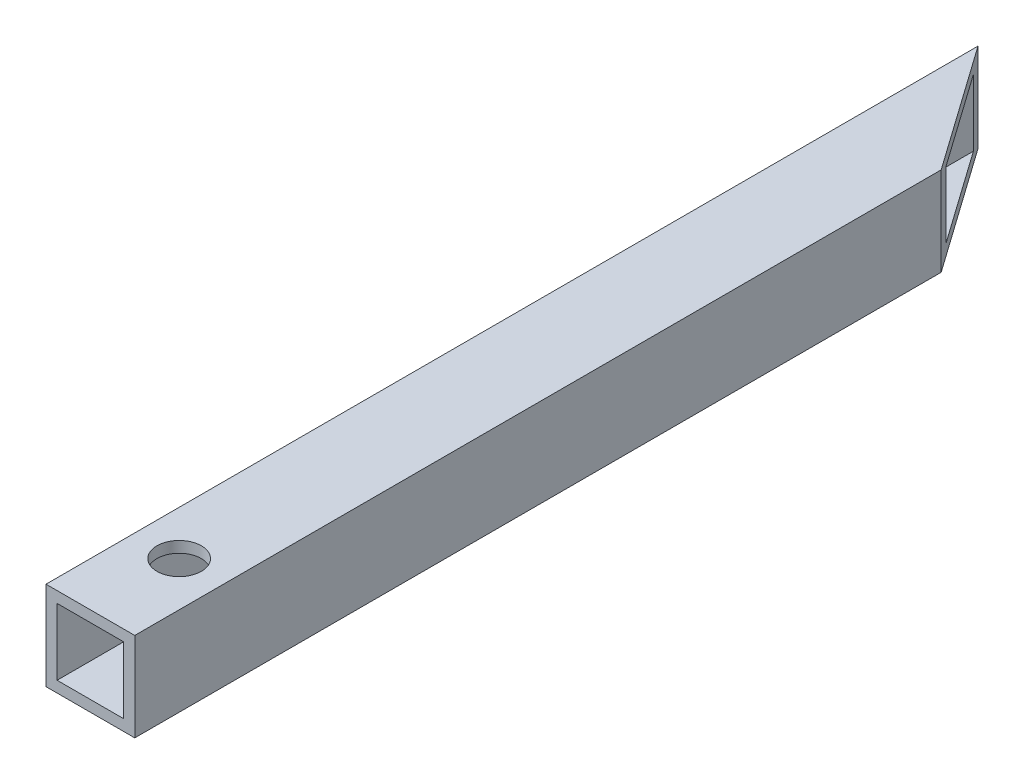
ISO-10303-21;
HEADER;
FILE_DESCRIPTION(('STEP AP214'),'2;1');
FILE_NAME('part.step','',(''),(''),'','','');
FILE_SCHEMA(('AUTOMOTIVE_DESIGN { 1 0 10303 214 1 1 1 1 }'));
ENDSEC;
DATA;
#1=APPLICATION_CONTEXT('core data for automotive mechanical design processes');
#2=APPLICATION_PROTOCOL_DEFINITION('international standard','automotive_design',2000,#1);
#3=PRODUCT_CONTEXT('',#1,'mechanical');
#4=PRODUCT('Part','Part','',(#3));
#5=PRODUCT_RELATED_PRODUCT_CATEGORY('part','',(#4));
#6=PRODUCT_DEFINITION_FORMATION('','',#4);
#7=PRODUCT_DEFINITION_CONTEXT('part definition',#1,'design');
#8=PRODUCT_DEFINITION('design','',#6,#7);
#9=PRODUCT_DEFINITION_SHAPE('','',#8);
#10=(LENGTH_UNIT() NAMED_UNIT(*) SI_UNIT(.MILLI.,.METRE.));
#11=(NAMED_UNIT(*) PLANE_ANGLE_UNIT() SI_UNIT($,.RADIAN.));
#12=(NAMED_UNIT(*) SI_UNIT($,.STERADIAN.) SOLID_ANGLE_UNIT());
#13=UNCERTAINTY_MEASURE_WITH_UNIT(LENGTH_MEASURE(1.E-05),#10,'distance_accuracy_value','');
#14=(GEOMETRIC_REPRESENTATION_CONTEXT(3) GLOBAL_UNCERTAINTY_ASSIGNED_CONTEXT((#13)) GLOBAL_UNIT_ASSIGNED_CONTEXT((#10,
#11,#12)) REPRESENTATION_CONTEXT('',''));
#15=CARTESIAN_POINT('',(0.,0.,0.));
#16=DIRECTION('',(0.,0.,1.));
#17=DIRECTION('',(1.,0.,0.));
#18=AXIS2_PLACEMENT_3D('',#15,#16,#17);
#19=CARTESIAN_POINT('',(0.,0.,266.7));
#20=DIRECTION('',(0.,0.,-1.));
#21=DIRECTION('',(-1.,0.,0.));
#22=AXIS2_PLACEMENT_3D('',#19,#20,#21);
#23=PLANE('',#22);
#24=DIRECTION('',(0.,-1.,0.));
#25=VECTOR('',#24,1.);
#26=CARTESIAN_POINT('',(0.,0.,266.7));
#27=LINE('',#26,#25);
#28=CARTESIAN_POINT('',(0.,25.4,266.7));
#29=VERTEX_POINT('',#28);
#30=CARTESIAN_POINT('',(0.,0.,266.7));
#31=VERTEX_POINT('',#30);
#32=EDGE_CURVE('E144',#29,#31,#27,.T.);
#33=ORIENTED_EDGE('',*,*,#32,.T.);
#34=DIRECTION('',(1.,0.,0.));
#35=VECTOR('',#34,1.);
#36=CARTESIAN_POINT('',(0.,0.,266.7));
#37=LINE('',#36,#35);
#38=CARTESIAN_POINT('',(25.4,0.,266.7));
#39=VERTEX_POINT('',#38);
#40=EDGE_CURVE('E136',#31,#39,#37,.T.);
#41=ORIENTED_EDGE('',*,*,#40,.T.);
#42=DIRECTION('',(0.,1.,0.));
#43=VECTOR('',#42,1.);
#44=CARTESIAN_POINT('',(25.4,0.,266.7));
#45=LINE('',#44,#43);
#46=CARTESIAN_POINT('',(25.4,25.4,266.7));
#47=VERTEX_POINT('',#46);
#48=EDGE_CURVE('E172',#39,#47,#45,.T.);
#49=ORIENTED_EDGE('',*,*,#48,.T.);
#50=DIRECTION('',(-1.,0.,0.));
#51=VECTOR('',#50,1.);
#52=CARTESIAN_POINT('',(0.,25.4,266.7));
#53=LINE('',#52,#51);
#54=EDGE_CURVE('E157',#47,#29,#53,.T.);
#55=ORIENTED_EDGE('',*,*,#54,.T.);
#56=EDGE_LOOP('',(#33,#41,#49,#55));
#57=FACE_BOUND('',#56,.T.);
#58=DIRECTION('',(0.,-1.,0.));
#59=VECTOR('',#58,1.);
#60=CARTESIAN_POINT('',(3.175,3.175,266.7));
#61=LINE('',#60,#59);
#62=CARTESIAN_POINT('',(3.175,22.225,266.7));
#63=VERTEX_POINT('',#62);
#64=CARTESIAN_POINT('',(3.175,3.175,266.7));
#65=VERTEX_POINT('',#64);
#66=EDGE_CURVE('E131',#63,#65,#61,.T.);
#67=ORIENTED_EDGE('',*,*,#66,.F.);
#68=DIRECTION('',(-1.,0.,0.));
#69=VECTOR('',#68,1.);
#70=CARTESIAN_POINT('',(3.175,22.225,266.7));
#71=LINE('',#70,#69);
#72=CARTESIAN_POINT('',(22.225,22.225,266.7));
#73=VERTEX_POINT('',#72);
#74=EDGE_CURVE('E188',#73,#63,#71,.T.);
#75=ORIENTED_EDGE('',*,*,#74,.F.);
#76=DIRECTION('',(0.,1.,0.));
#77=VECTOR('',#76,1.);
#78=CARTESIAN_POINT('',(22.225,3.175,266.7));
#79=LINE('',#78,#77);
#80=CARTESIAN_POINT('',(22.225,3.175,266.7));
#81=VERTEX_POINT('',#80);
#82=EDGE_CURVE('E191',#81,#73,#79,.T.);
#83=ORIENTED_EDGE('',*,*,#82,.F.);
#84=DIRECTION('',(1.,0.,0.));
#85=VECTOR('',#84,1.);
#86=CARTESIAN_POINT('',(3.175,3.175,266.7));
#87=LINE('',#86,#85);
#88=EDGE_CURVE('E194',#65,#81,#87,.T.);
#89=ORIENTED_EDGE('',*,*,#88,.F.);
#90=EDGE_LOOP('',(#67,#75,#83,#89));
#91=FACE_BOUND('',#90,.T.);
#92=ADVANCED_FACE('F38',(#57,#91),#23,.F.);
#93=CARTESIAN_POINT('',(0.,0.,266.7));
#94=DIRECTION('',(1.,0.,0.));
#95=DIRECTION('',(0.,0.,-1.));
#96=AXIS2_PLACEMENT_3D('',#93,#94,#95);
#97=PLANE('',#96);
#98=DIRECTION('',(0.,-1.,0.));
#99=VECTOR('',#98,1.);
#100=CARTESIAN_POINT('',(0.,0.,0.));
#101=LINE('',#100,#99);
#102=CARTESIAN_POINT('',(0.,25.4,0.));
#103=VERTEX_POINT('',#102);
#104=CARTESIAN_POINT('',(0.,0.,0.));
#105=VERTEX_POINT('',#104);
#106=EDGE_CURVE('E123',#103,#105,#101,.T.);
#107=ORIENTED_EDGE('',*,*,#106,.T.);
#108=DIRECTION('',(0.,0.,-1.));
#109=VECTOR('',#108,1.);
#110=CARTESIAN_POINT('',(0.,0.,266.7));
#111=LINE('',#110,#109);
#112=EDGE_CURVE('E11',#31,#105,#111,.T.);
#113=ORIENTED_EDGE('',*,*,#112,.F.);
#114=ORIENTED_EDGE('',*,*,#32,.F.);
#115=DIRECTION('',(0.,0.,-1.));
#116=VECTOR('',#115,1.);
#117=CARTESIAN_POINT('',(0.,25.4,266.7));
#118=LINE('',#117,#116);
#119=EDGE_CURVE('E142',#29,#103,#118,.T.);
#120=ORIENTED_EDGE('',*,*,#119,.T.);
#121=EDGE_LOOP('',(#107,#113,#114,#120));
#122=FACE_BOUND('',#121,.T.);
#123=ADVANCED_FACE('F40',(#122),#97,.F.);
#124=CARTESIAN_POINT('',(0.,0.,266.7));
#125=DIRECTION('',(0.,1.,0.));
#126=DIRECTION('',(0.,0.,1.));
#127=AXIS2_PLACEMENT_3D('',#124,#125,#126);
#128=PLANE('',#127);
#129=CARTESIAN_POINT('',(12.7,0.,241.3));
#130=DIRECTION('',(0.,1.,0.));
#131=DIRECTION('',(0.,0.,1.));
#132=AXIS2_PLACEMENT_3D('',#129,#130,#131);
#133=CIRCLE('',#132,6.34999999999999);
#134=CARTESIAN_POINT('',(12.7,0.,247.65));
#135=VERTEX_POINT('',#134);
#136=EDGE_CURVE('E222',#135,#135,#133,.T.);
#137=ORIENTED_EDGE('',*,*,#136,.T.);
#138=EDGE_LOOP('',(#137));
#139=FACE_BOUND('',#138,.T.);
#140=ORIENTED_EDGE('',*,*,#112,.T.);
#141=DIRECTION('',(-0.577166806381766,0.,-0.81662627781077));
#142=VECTOR('',#141,1.);
#143=CARTESIAN_POINT('',(25.4,0.,35.9381503354743));
#144=LINE('',#143,#142);
#145=CARTESIAN_POINT('',(25.4,0.,35.9381503354743));
#146=VERTEX_POINT('',#145);
#147=EDGE_CURVE('E120',#146,#105,#144,.T.);
#148=ORIENTED_EDGE('',*,*,#147,.F.);
#149=DIRECTION('',(0.,0.,-1.));
#150=VECTOR('',#149,1.);
#151=CARTESIAN_POINT('',(25.4,0.,266.7));
#152=LINE('',#151,#150);
#153=EDGE_CURVE('E48',#39,#146,#152,.T.);
#154=ORIENTED_EDGE('',*,*,#153,.F.);
#155=ORIENTED_EDGE('',*,*,#40,.F.);
#156=EDGE_LOOP('',(#140,#148,#154,#155));
#157=FACE_BOUND('',#156,.T.);
#158=ADVANCED_FACE('F135',(#139,#157),#128,.F.);
#159=CARTESIAN_POINT('',(25.4,0.,266.7));
#160=DIRECTION('',(-1.,0.,0.));
#161=DIRECTION('',(0.,0.,1.));
#162=AXIS2_PLACEMENT_3D('',#159,#160,#161);
#163=PLANE('',#162);
#164=ORIENTED_EDGE('',*,*,#153,.T.);
#165=DIRECTION('',(0.,1.,0.));
#166=VECTOR('',#165,1.);
#167=CARTESIAN_POINT('',(25.4,-0.001000000000001,35.9381503354743));
#168=LINE('',#167,#166);
#169=CARTESIAN_POINT('',(25.4,25.4,35.9381503354743));
#170=VERTEX_POINT('',#169);
#171=EDGE_CURVE('E126',#146,#170,#168,.T.);
#172=ORIENTED_EDGE('',*,*,#171,.T.);
#173=DIRECTION('',(0.,0.,-1.));
#174=VECTOR('',#173,1.);
#175=CARTESIAN_POINT('',(25.4,25.4,266.7));
#176=LINE('',#175,#174);
#177=EDGE_CURVE('E161',#47,#170,#176,.T.);
#178=ORIENTED_EDGE('',*,*,#177,.F.);
#179=ORIENTED_EDGE('',*,*,#48,.F.);
#180=EDGE_LOOP('',(#164,#172,#178,#179));
#181=FACE_BOUND('',#180,.T.);
#182=ADVANCED_FACE('F170',(#181),#163,.F.);
#183=CARTESIAN_POINT('',(0.,25.4,266.7));
#184=DIRECTION('',(0.,-1.,0.));
#185=DIRECTION('',(0.,0.,-1.));
#186=AXIS2_PLACEMENT_3D('',#183,#184,#185);
#187=PLANE('',#186);
#188=CARTESIAN_POINT('',(12.7,25.4,241.3));
#189=DIRECTION('',(0.,1.,0.));
#190=DIRECTION('',(0.,0.,1.));
#191=AXIS2_PLACEMENT_3D('',#188,#189,#190);
#192=CIRCLE('',#191,6.34999999999999);
#193=CARTESIAN_POINT('',(12.7,25.4,247.65));
#194=VERTEX_POINT('',#193);
#195=EDGE_CURVE('E219',#194,#194,#192,.T.);
#196=ORIENTED_EDGE('',*,*,#195,.F.);
#197=EDGE_LOOP('',(#196));
#198=FACE_BOUND('',#197,.T.);
#199=ORIENTED_EDGE('',*,*,#177,.T.);
#200=DIRECTION('',(0.577166806381766,0.,0.81662627781077));
#201=VECTOR('',#200,1.);
#202=CARTESIAN_POINT('',(25.4,25.4,35.9381503354743));
#203=LINE('',#202,#201);
#204=EDGE_CURVE('E212',#103,#170,#203,.T.);
#205=ORIENTED_EDGE('',*,*,#204,.F.);
#206=ORIENTED_EDGE('',*,*,#119,.F.);
#207=ORIENTED_EDGE('',*,*,#54,.F.);
#208=EDGE_LOOP('',(#199,#205,#206,#207));
#209=FACE_BOUND('',#208,.T.);
#210=ADVANCED_FACE('F258',(#198,#209),#187,.F.);
#211=CARTESIAN_POINT('',(3.175,3.175,266.7));
#212=DIRECTION('',(1.,0.,0.));
#213=DIRECTION('',(0.,0.,-1.));
#214=AXIS2_PLACEMENT_3D('',#211,#212,#213);
#215=PLANE('',#214);
#216=DIRECTION('',(0.,1.,0.));
#217=VECTOR('',#216,1.);
#218=CARTESIAN_POINT('',(3.175,-0.001000000000001,4.4922687919342));
#219=LINE('',#218,#217);
#220=CARTESIAN_POINT('',(3.17499999999999,3.175,4.49226879193416));
#221=VERTEX_POINT('',#220);
#222=CARTESIAN_POINT('',(3.17499999999999,22.225,4.49226879193416));
#223=VERTEX_POINT('',#222);
#224=EDGE_CURVE('E132',#221,#223,#219,.T.);
#225=ORIENTED_EDGE('',*,*,#224,.T.);
#226=DIRECTION('',(0.,0.,-1.));
#227=VECTOR('',#226,1.);
#228=CARTESIAN_POINT('',(3.175,22.225,266.7));
#229=LINE('',#228,#227);
#230=EDGE_CURVE('E184',#63,#223,#229,.T.);
#231=ORIENTED_EDGE('',*,*,#230,.F.);
#232=ORIENTED_EDGE('',*,*,#66,.T.);
#233=DIRECTION('',(0.,0.,-1.));
#234=VECTOR('',#233,1.);
#235=CARTESIAN_POINT('',(3.175,3.175,266.7));
#236=LINE('',#235,#234);
#237=EDGE_CURVE('E145',#65,#221,#236,.T.);
#238=ORIENTED_EDGE('',*,*,#237,.T.);
#239=EDGE_LOOP('',(#225,#231,#232,#238));
#240=FACE_BOUND('',#239,.T.);
#241=ADVANCED_FACE('F246',(#240),#215,.T.);
#242=CARTESIAN_POINT('',(3.175,3.175,266.7));
#243=DIRECTION('',(0.,1.,0.));
#244=DIRECTION('',(0.,0.,1.));
#245=AXIS2_PLACEMENT_3D('',#242,#243,#244);
#246=PLANE('',#245);
#247=CARTESIAN_POINT('',(12.7,3.175,241.3));
#248=DIRECTION('',(0.,1.,0.));
#249=DIRECTION('',(0.,0.,1.));
#250=AXIS2_PLACEMENT_3D('',#247,#248,#249);
#251=CIRCLE('',#250,6.34999999999999);
#252=CARTESIAN_POINT('',(12.7,3.175,247.65));
#253=VERTEX_POINT('',#252);
#254=EDGE_CURVE('E215',#253,#253,#251,.T.);
#255=ORIENTED_EDGE('',*,*,#254,.F.);
#256=EDGE_LOOP('',(#255));
#257=FACE_BOUND('',#256,.T.);
#258=DIRECTION('',(-0.577166806381766,0.,-0.81662627781077));
#259=VECTOR('',#258,1.);
#260=CARTESIAN_POINT('',(25.4,3.175,35.9381503354743));
#261=LINE('',#260,#259);
#262=CARTESIAN_POINT('',(22.225,3.175,31.44588154354));
#263=VERTEX_POINT('',#262);
#264=EDGE_CURVE('E201',#263,#221,#261,.T.);
#265=ORIENTED_EDGE('',*,*,#264,.T.);
#266=ORIENTED_EDGE('',*,*,#237,.F.);
#267=ORIENTED_EDGE('',*,*,#88,.T.);
#268=DIRECTION('',(0.,0.,-1.));
#269=VECTOR('',#268,1.);
#270=CARTESIAN_POINT('',(22.225,3.175,266.7));
#271=LINE('',#270,#269);
#272=EDGE_CURVE('E153',#81,#263,#271,.T.);
#273=ORIENTED_EDGE('',*,*,#272,.T.);
#274=EDGE_LOOP('',(#265,#266,#267,#273));
#275=FACE_BOUND('',#274,.T.);
#276=ADVANCED_FACE('F249',(#257,#275),#246,.T.);
#277=CARTESIAN_POINT('',(22.225,3.175,266.7));
#278=DIRECTION('',(-1.,0.,0.));
#279=DIRECTION('',(0.,0.,1.));
#280=AXIS2_PLACEMENT_3D('',#277,#278,#279);
#281=PLANE('',#280);
#282=DIRECTION('',(0.,-1.,0.));
#283=VECTOR('',#282,1.);
#284=CARTESIAN_POINT('',(22.225,-0.001000000000001,31.44588154354));
#285=LINE('',#284,#283);
#286=CARTESIAN_POINT('',(22.225,22.225,31.44588154354));
#287=VERTEX_POINT('',#286);
#288=EDGE_CURVE('E58',#287,#263,#285,.T.);
#289=ORIENTED_EDGE('',*,*,#288,.T.);
#290=ORIENTED_EDGE('',*,*,#272,.F.);
#291=ORIENTED_EDGE('',*,*,#82,.T.);
#292=DIRECTION('',(0.,0.,-1.));
#293=VECTOR('',#292,1.);
#294=CARTESIAN_POINT('',(22.225,22.225,266.7));
#295=LINE('',#294,#293);
#296=EDGE_CURVE('E68',#73,#287,#295,.T.);
#297=ORIENTED_EDGE('',*,*,#296,.T.);
#298=EDGE_LOOP('',(#289,#290,#291,#297));
#299=FACE_BOUND('',#298,.T.);
#300=ADVANCED_FACE('F235',(#299),#281,.T.);
#301=CARTESIAN_POINT('',(3.175,22.225,266.7));
#302=DIRECTION('',(0.,-1.,0.));
#303=DIRECTION('',(0.,0.,-1.));
#304=AXIS2_PLACEMENT_3D('',#301,#302,#303);
#305=PLANE('',#304);
#306=CARTESIAN_POINT('',(12.7,22.225,241.3));
#307=DIRECTION('',(0.,-1.,0.));
#308=DIRECTION('',(0.,0.,-1.));
#309=AXIS2_PLACEMENT_3D('',#306,#307,#308);
#310=CIRCLE('',#309,6.34999999999999);
#311=CARTESIAN_POINT('',(12.7,22.225,234.95));
#312=VERTEX_POINT('',#311);
#313=EDGE_CURVE('E42',#312,#312,#310,.T.);
#314=ORIENTED_EDGE('',*,*,#313,.F.);
#315=EDGE_LOOP('',(#314));
#316=FACE_BOUND('',#315,.T.);
#317=DIRECTION('',(0.577166806381766,0.,0.81662627781077));
#318=VECTOR('',#317,1.);
#319=CARTESIAN_POINT('',(25.4,22.225,35.9381503354743));
#320=LINE('',#319,#318);
#321=EDGE_CURVE('E207',#223,#287,#320,.T.);
#322=ORIENTED_EDGE('',*,*,#321,.T.);
#323=ORIENTED_EDGE('',*,*,#296,.F.);
#324=ORIENTED_EDGE('',*,*,#74,.T.);
#325=ORIENTED_EDGE('',*,*,#230,.T.);
#326=EDGE_LOOP('',(#322,#323,#324,#325));
#327=FACE_BOUND('',#326,.T.);
#328=ADVANCED_FACE('F233',(#316,#327),#305,.T.);
#329=CARTESIAN_POINT('',(25.4,-0.001000000000001,35.9381503354743));
#330=DIRECTION('',(-0.81662627781077,0.,0.577166806381766));
#331=DIRECTION('',(0.577166806381766,0.,0.81662627781077));
#332=AXIS2_PLACEMENT_3D('',#329,#330,#331);
#333=PLANE('',#332);
#334=ORIENTED_EDGE('',*,*,#264,.F.);
#335=ORIENTED_EDGE('',*,*,#288,.F.);
#336=ORIENTED_EDGE('',*,*,#321,.F.);
#337=ORIENTED_EDGE('',*,*,#224,.F.);
#338=EDGE_LOOP('',(#334,#335,#336,#337));
#339=FACE_BOUND('',#338,.T.);
#340=ORIENTED_EDGE('',*,*,#147,.T.);
#341=ORIENTED_EDGE('',*,*,#106,.F.);
#342=ORIENTED_EDGE('',*,*,#204,.T.);
#343=ORIENTED_EDGE('',*,*,#171,.F.);
#344=EDGE_LOOP('',(#340,#341,#342,#343));
#345=FACE_BOUND('',#344,.T.);
#346=ADVANCED_FACE('F121',(#339,#345),#333,.F.);
#347=CARTESIAN_POINT('',(12.7,0.,241.3));
#348=DIRECTION('',(0.,1.,0.));
#349=DIRECTION('',(0.,0.,1.));
#350=AXIS2_PLACEMENT_3D('',#347,#348,#349);
#351=CYLINDRICAL_SURFACE('',#350,6.34999999999999);
#352=ORIENTED_EDGE('',*,*,#313,.T.);
#353=EDGE_LOOP('',(#352));
#354=FACE_BOUND('',#353,.T.);
#355=ORIENTED_EDGE('',*,*,#195,.T.);
#356=EDGE_LOOP('',(#355));
#357=FACE_BOUND('',#356,.T.);
#358=ADVANCED_FACE('F230',(#354,#357),#351,.F.);
#359=ORIENTED_EDGE('',*,*,#254,.T.);
#360=EDGE_LOOP('',(#359));
#361=FACE_BOUND('',#360,.T.);
#362=ORIENTED_EDGE('',*,*,#136,.F.);
#363=EDGE_LOOP('',(#362));
#364=FACE_BOUND('',#363,.T.);
#365=ADVANCED_FACE('F297',(#361,#364),#351,.F.);
#366=CLOSED_SHELL('',(#92,#123,#158,#182,#210,#241,#276,#300,#328,#346,#358,#365));
#367=MANIFOLD_SOLID_BREP('B2',#366);
#368=ADVANCED_BREP_SHAPE_REPRESENTATION('',(#18,#367),#14);
#369=SHAPE_DEFINITION_REPRESENTATION(#9,#368);
ENDSEC;
END-ISO-10303-21;
